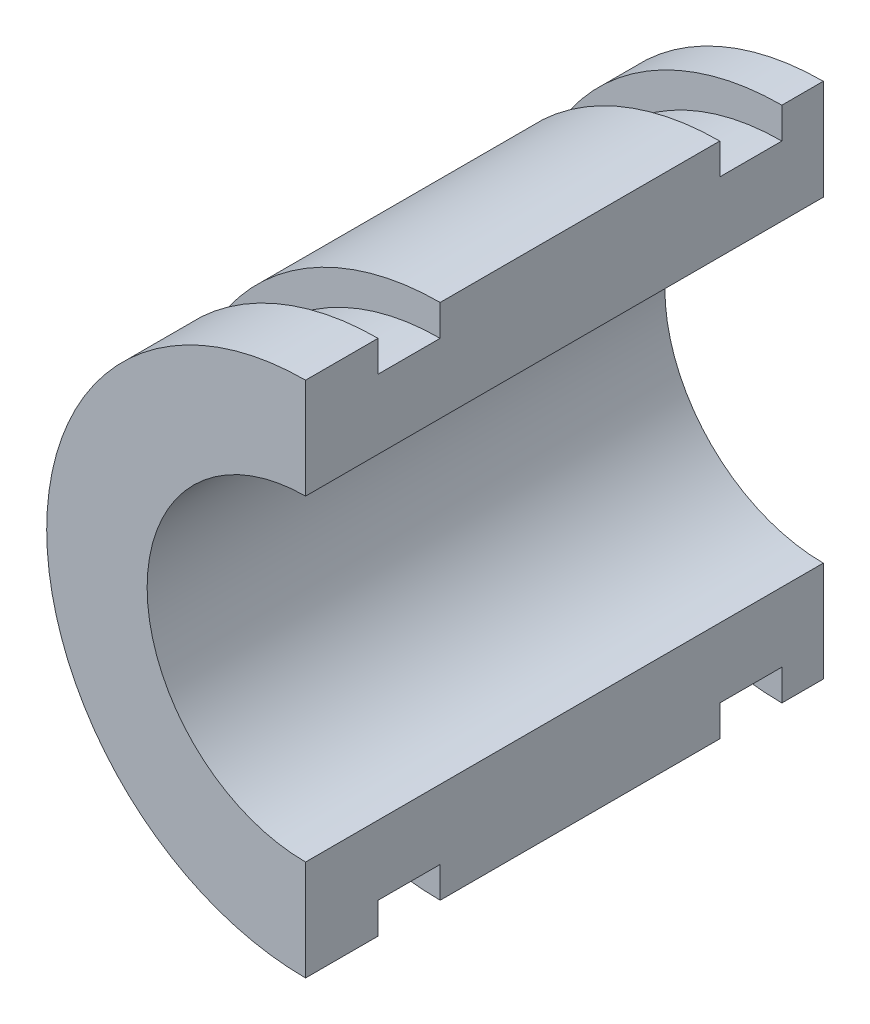
ISO-10303-21;
HEADER;
FILE_DESCRIPTION(('STEP AP214'),'2;1');
FILE_NAME('part.step','',(''),(''),'','','');
FILE_SCHEMA(('AUTOMOTIVE_DESIGN { 1 0 10303 214 1 1 1 1 }'));
ENDSEC;
DATA;
#1=APPLICATION_CONTEXT('core data for automotive mechanical design processes');
#2=APPLICATION_PROTOCOL_DEFINITION('international standard','automotive_design',2000,#1);
#3=PRODUCT_CONTEXT('',#1,'mechanical');
#4=PRODUCT('Part','Part','',(#3));
#5=PRODUCT_RELATED_PRODUCT_CATEGORY('part','',(#4));
#6=PRODUCT_DEFINITION_FORMATION('','',#4);
#7=PRODUCT_DEFINITION_CONTEXT('part definition',#1,'design');
#8=PRODUCT_DEFINITION('design','',#6,#7);
#9=PRODUCT_DEFINITION_SHAPE('','',#8);
#10=(LENGTH_UNIT() NAMED_UNIT(*) SI_UNIT(.MILLI.,.METRE.));
#11=(NAMED_UNIT(*) PLANE_ANGLE_UNIT() SI_UNIT($,.RADIAN.));
#12=(NAMED_UNIT(*) SI_UNIT($,.STERADIAN.) SOLID_ANGLE_UNIT());
#13=UNCERTAINTY_MEASURE_WITH_UNIT(LENGTH_MEASURE(1.E-05),#10,'distance_accuracy_value','');
#14=(GEOMETRIC_REPRESENTATION_CONTEXT(3) GLOBAL_UNCERTAINTY_ASSIGNED_CONTEXT((#13)) GLOBAL_UNIT_ASSIGNED_CONTEXT((#10,
#11,#12)) REPRESENTATION_CONTEXT('',''));
#15=CARTESIAN_POINT('',(0.,0.,0.));
#16=DIRECTION('',(0.,0.,1.));
#17=DIRECTION('',(1.,0.,0.));
#18=AXIS2_PLACEMENT_3D('',#15,#16,#17);
#19=CARTESIAN_POINT('',(0.,0.,25.));
#20=DIRECTION('',(0.,0.,-1.));
#21=DIRECTION('',(-1.,0.,0.));
#22=AXIS2_PLACEMENT_3D('',#19,#20,#21);
#23=CYLINDRICAL_SURFACE('',#22,12.5);
#24=DIRECTION('',(0.,0.,-1.));
#25=VECTOR('',#24,1.);
#26=CARTESIAN_POINT('',(0.,12.5,25.));
#27=LINE('',#26,#25);
#28=CARTESIAN_POINT('',(0.,12.5,18.5));
#29=VERTEX_POINT('',#28);
#30=CARTESIAN_POINT('',(0.,12.5,5.));
#31=VERTEX_POINT('',#30);
#32=EDGE_CURVE('E138',#29,#31,#27,.T.);
#33=ORIENTED_EDGE('',*,*,#32,.T.);
#34=CARTESIAN_POINT('',(0.,0.,5.));
#35=DIRECTION('',(0.,0.,-1.));
#36=DIRECTION('',(-1.,0.,0.));
#37=AXIS2_PLACEMENT_3D('',#34,#35,#36);
#38=CIRCLE('',#37,12.5);
#39=CARTESIAN_POINT('',(0.,-12.5,5.));
#40=VERTEX_POINT('',#39);
#41=EDGE_CURVE('E121',#40,#31,#38,.T.);
#42=ORIENTED_EDGE('',*,*,#41,.F.);
#43=DIRECTION('',(0.,0.,-1.));
#44=VECTOR('',#43,1.);
#45=CARTESIAN_POINT('',(0.,-12.5,25.));
#46=LINE('',#45,#44);
#47=CARTESIAN_POINT('',(0.,-12.5,18.5));
#48=VERTEX_POINT('',#47);
#49=EDGE_CURVE('E162',#48,#40,#46,.T.);
#50=ORIENTED_EDGE('',*,*,#49,.F.);
#51=CARTESIAN_POINT('',(0.,0.,18.5));
#52=DIRECTION('',(0.,0.,-1.));
#53=DIRECTION('',(-1.,0.,0.));
#54=AXIS2_PLACEMENT_3D('',#51,#52,#53);
#55=CIRCLE('',#54,12.5);
#56=EDGE_CURVE('E141',#48,#29,#55,.T.);
#57=ORIENTED_EDGE('',*,*,#56,.T.);
#58=EDGE_LOOP('',(#33,#42,#50,#57));
#59=FACE_BOUND('',#58,.T.);
#60=ADVANCED_FACE('F33',(#59),#23,.T.);
#61=CARTESIAN_POINT('',(0.,12.5,25.));
#62=VERTEX_POINT('',#61);
#63=CARTESIAN_POINT('',(0.,12.5,21.5));
#64=VERTEX_POINT('',#63);
#65=EDGE_CURVE('E142',#62,#64,#27,.T.);
#66=ORIENTED_EDGE('',*,*,#65,.T.);
#67=CARTESIAN_POINT('',(0.,0.,21.5));
#68=DIRECTION('',(0.,0.,-1.));
#69=DIRECTION('',(-1.,0.,0.));
#70=AXIS2_PLACEMENT_3D('',#67,#68,#69);
#71=CIRCLE('',#70,12.5);
#72=CARTESIAN_POINT('',(0.,-12.5,21.5));
#73=VERTEX_POINT('',#72);
#74=EDGE_CURVE('E190',#73,#64,#71,.T.);
#75=ORIENTED_EDGE('',*,*,#74,.F.);
#76=CARTESIAN_POINT('',(0.,-12.5,25.));
#77=VERTEX_POINT('',#76);
#78=EDGE_CURVE('E158',#77,#73,#46,.T.);
#79=ORIENTED_EDGE('',*,*,#78,.F.);
#80=CARTESIAN_POINT('',(0.,0.,25.));
#81=DIRECTION('',(0.,0.,1.));
#82=DIRECTION('',(-1.,0.,0.));
#83=AXIS2_PLACEMENT_3D('',#80,#81,#82);
#84=CIRCLE('',#83,12.5);
#85=EDGE_CURVE('E207',#62,#77,#84,.T.);
#86=ORIENTED_EDGE('',*,*,#85,.F.);
#87=EDGE_LOOP('',(#66,#75,#79,#86));
#88=FACE_BOUND('',#87,.T.);
#89=ADVANCED_FACE('F239',(#88),#23,.T.);
#90=CARTESIAN_POINT('',(0.,-12.5,2.));
#91=VERTEX_POINT('',#90);
#92=CARTESIAN_POINT('',(0.,-12.5,0.));
#93=VERTEX_POINT('',#92);
#94=EDGE_CURVE('E157',#91,#93,#46,.T.);
#95=ORIENTED_EDGE('',*,*,#94,.F.);
#96=CARTESIAN_POINT('',(0.,0.,2.));
#97=DIRECTION('',(0.,0.,-1.));
#98=DIRECTION('',(-1.,0.,0.));
#99=AXIS2_PLACEMENT_3D('',#96,#97,#98);
#100=CIRCLE('',#99,12.5);
#101=CARTESIAN_POINT('',(0.,12.5,2.));
#102=VERTEX_POINT('',#101);
#103=EDGE_CURVE('E131',#91,#102,#100,.T.);
#104=ORIENTED_EDGE('',*,*,#103,.T.);
#105=CARTESIAN_POINT('',(0.,12.5,0.));
#106=VERTEX_POINT('',#105);
#107=EDGE_CURVE('E143',#102,#106,#27,.T.);
#108=ORIENTED_EDGE('',*,*,#107,.T.);
#109=CARTESIAN_POINT('',(0.,0.,0.));
#110=DIRECTION('',(0.,0.,1.));
#111=DIRECTION('',(-1.,0.,0.));
#112=AXIS2_PLACEMENT_3D('',#109,#110,#111);
#113=CIRCLE('',#112,12.5);
#114=EDGE_CURVE('E206',#106,#93,#113,.T.);
#115=ORIENTED_EDGE('',*,*,#114,.T.);
#116=EDGE_LOOP('',(#95,#104,#108,#115));
#117=FACE_BOUND('',#116,.T.);
#118=ADVANCED_FACE('F35',(#117),#23,.T.);
#119=CARTESIAN_POINT('',(0.,-7.65,25.));
#120=DIRECTION('',(-1.,0.,0.));
#121=DIRECTION('',(0.,0.,1.));
#122=AXIS2_PLACEMENT_3D('',#119,#120,#121);
#123=PLANE('',#122);
#124=ORIENTED_EDGE('',*,*,#49,.T.);
#125=DIRECTION('',(0.,1.,0.));
#126=VECTOR('',#125,1.);
#127=CARTESIAN_POINT('',(0.,-7.65,5.));
#128=LINE('',#127,#126);
#129=CARTESIAN_POINT('',(0.,-11.,5.));
#130=VERTEX_POINT('',#129);
#131=EDGE_CURVE('E126',#40,#130,#128,.T.);
#132=ORIENTED_EDGE('',*,*,#131,.T.);
#133=DIRECTION('',(0.,0.,-1.));
#134=VECTOR('',#133,1.);
#135=CARTESIAN_POINT('',(0.,-11.,0.));
#136=LINE('',#135,#134);
#137=CARTESIAN_POINT('',(0.,-11.,2.));
#138=VERTEX_POINT('',#137);
#139=EDGE_CURVE('E186',#130,#138,#136,.T.);
#140=ORIENTED_EDGE('',*,*,#139,.T.);
#141=DIRECTION('',(0.,-1.,0.));
#142=VECTOR('',#141,1.);
#143=CARTESIAN_POINT('',(0.,-7.65,2.));
#144=LINE('',#143,#142);
#145=EDGE_CURVE('E184',#138,#91,#144,.T.);
#146=ORIENTED_EDGE('',*,*,#145,.T.);
#147=ORIENTED_EDGE('',*,*,#94,.T.);
#148=DIRECTION('',(0.,1.,0.));
#149=VECTOR('',#148,1.);
#150=CARTESIAN_POINT('',(0.,-7.65,0.));
#151=LINE('',#150,#149);
#152=CARTESIAN_POINT('',(0.,-7.65,0.));
#153=VERTEX_POINT('',#152);
#154=EDGE_CURVE('E216',#93,#153,#151,.T.);
#155=ORIENTED_EDGE('',*,*,#154,.T.);
#156=DIRECTION('',(0.,0.,-1.));
#157=VECTOR('',#156,1.);
#158=CARTESIAN_POINT('',(0.,-7.65,25.));
#159=LINE('',#158,#157);
#160=CARTESIAN_POINT('',(0.,-7.65,25.));
#161=VERTEX_POINT('',#160);
#162=EDGE_CURVE('E154',#161,#153,#159,.T.);
#163=ORIENTED_EDGE('',*,*,#162,.F.);
#164=DIRECTION('',(0.,1.,0.));
#165=VECTOR('',#164,1.);
#166=CARTESIAN_POINT('',(0.,-7.65,25.));
#167=LINE('',#166,#165);
#168=EDGE_CURVE('E210',#77,#161,#167,.T.);
#169=ORIENTED_EDGE('',*,*,#168,.F.);
#170=ORIENTED_EDGE('',*,*,#78,.T.);
#171=DIRECTION('',(0.,1.,0.));
#172=VECTOR('',#171,1.);
#173=CARTESIAN_POINT('',(0.,-7.65,21.5));
#174=LINE('',#173,#172);
#175=CARTESIAN_POINT('',(0.,-11.,21.5));
#176=VERTEX_POINT('',#175);
#177=EDGE_CURVE('E203',#73,#176,#174,.T.);
#178=ORIENTED_EDGE('',*,*,#177,.T.);
#179=DIRECTION('',(0.,0.,-1.));
#180=VECTOR('',#179,1.);
#181=CARTESIAN_POINT('',(0.,-11.,0.));
#182=LINE('',#181,#180);
#183=CARTESIAN_POINT('',(0.,-11.,18.5));
#184=VERTEX_POINT('',#183);
#185=EDGE_CURVE('E200',#176,#184,#182,.T.);
#186=ORIENTED_EDGE('',*,*,#185,.T.);
#187=DIRECTION('',(0.,-1.,0.));
#188=VECTOR('',#187,1.);
#189=CARTESIAN_POINT('',(0.,-7.65,18.5));
#190=LINE('',#189,#188);
#191=EDGE_CURVE('E197',#184,#48,#190,.T.);
#192=ORIENTED_EDGE('',*,*,#191,.T.);
#193=EDGE_LOOP('',(#124,#132,#140,#146,#147,#155,#163,#169,#170,#178,#186,#192));
#194=FACE_BOUND('',#193,.T.);
#195=ADVANCED_FACE('F229',(#194),#123,.F.);
#196=CARTESIAN_POINT('',(0.,0.,25.));
#197=DIRECTION('',(0.,0.,-1.));
#198=DIRECTION('',(-1.,0.,0.));
#199=AXIS2_PLACEMENT_3D('',#196,#197,#198);
#200=CYLINDRICAL_SURFACE('',#199,7.65);
#201=CARTESIAN_POINT('',(0.,0.,0.));
#202=DIRECTION('',(0.,0.,-1.));
#203=DIRECTION('',(1.,0.,0.));
#204=AXIS2_PLACEMENT_3D('',#201,#202,#203);
#205=CIRCLE('',#204,7.65);
#206=CARTESIAN_POINT('',(0.,7.65,0.));
#207=VERTEX_POINT('',#206);
#208=EDGE_CURVE('E217',#153,#207,#205,.T.);
#209=ORIENTED_EDGE('',*,*,#208,.T.);
#210=DIRECTION('',(0.,0.,-1.));
#211=VECTOR('',#210,1.);
#212=CARTESIAN_POINT('',(0.,7.65,25.));
#213=LINE('',#212,#211);
#214=CARTESIAN_POINT('',(0.,7.65,25.));
#215=VERTEX_POINT('',#214);
#216=EDGE_CURVE('E146',#215,#207,#213,.T.);
#217=ORIENTED_EDGE('',*,*,#216,.F.);
#218=CARTESIAN_POINT('',(0.,0.,25.));
#219=DIRECTION('',(0.,0.,-1.));
#220=DIRECTION('',(1.,0.,0.));
#221=AXIS2_PLACEMENT_3D('',#218,#219,#220);
#222=CIRCLE('',#221,7.65);
#223=EDGE_CURVE('E212',#161,#215,#222,.T.);
#224=ORIENTED_EDGE('',*,*,#223,.F.);
#225=ORIENTED_EDGE('',*,*,#162,.T.);
#226=EDGE_LOOP('',(#209,#217,#224,#225));
#227=FACE_BOUND('',#226,.T.);
#228=ADVANCED_FACE('F231',(#227),#200,.F.);
#229=CARTESIAN_POINT('',(0.,12.5,25.));
#230=DIRECTION('',(-1.,0.,0.));
#231=DIRECTION('',(0.,0.,1.));
#232=AXIS2_PLACEMENT_3D('',#229,#230,#231);
#233=PLANE('',#232);
#234=DIRECTION('',(0.,0.,-1.));
#235=VECTOR('',#234,1.);
#236=CARTESIAN_POINT('',(0.,11.,0.));
#237=LINE('',#236,#235);
#238=CARTESIAN_POINT('',(0.,11.,2.));
#239=VERTEX_POINT('',#238);
#240=CARTESIAN_POINT('',(0.,11.,5.));
#241=VERTEX_POINT('',#240);
#242=EDGE_CURVE('E41',#239,#241,#237,.F.);
#243=ORIENTED_EDGE('',*,*,#242,.T.);
#244=DIRECTION('',(0.,1.,0.));
#245=VECTOR('',#244,1.);
#246=CARTESIAN_POINT('',(0.,12.5,5.));
#247=LINE('',#246,#245);
#248=EDGE_CURVE('E11',#241,#31,#247,.T.);
#249=ORIENTED_EDGE('',*,*,#248,.T.);
#250=ORIENTED_EDGE('',*,*,#32,.F.);
#251=DIRECTION('',(0.,-1.,0.));
#252=VECTOR('',#251,1.);
#253=CARTESIAN_POINT('',(0.,12.5,18.5));
#254=LINE('',#253,#252);
#255=CARTESIAN_POINT('',(0.,11.,18.5));
#256=VERTEX_POINT('',#255);
#257=EDGE_CURVE('E161',#29,#256,#254,.T.);
#258=ORIENTED_EDGE('',*,*,#257,.T.);
#259=DIRECTION('',(0.,0.,-1.));
#260=VECTOR('',#259,1.);
#261=CARTESIAN_POINT('',(0.,11.,0.));
#262=LINE('',#261,#260);
#263=CARTESIAN_POINT('',(0.,11.,21.5));
#264=VERTEX_POINT('',#263);
#265=EDGE_CURVE('E164',#256,#264,#262,.F.);
#266=ORIENTED_EDGE('',*,*,#265,.T.);
#267=DIRECTION('',(0.,1.,0.));
#268=VECTOR('',#267,1.);
#269=CARTESIAN_POINT('',(0.,12.5,21.5));
#270=LINE('',#269,#268);
#271=EDGE_CURVE('E167',#264,#64,#270,.T.);
#272=ORIENTED_EDGE('',*,*,#271,.T.);
#273=ORIENTED_EDGE('',*,*,#65,.F.);
#274=DIRECTION('',(0.,1.,0.));
#275=VECTOR('',#274,1.);
#276=CARTESIAN_POINT('',(0.,12.5,25.));
#277=LINE('',#276,#275);
#278=EDGE_CURVE('E147',#215,#62,#277,.T.);
#279=ORIENTED_EDGE('',*,*,#278,.F.);
#280=ORIENTED_EDGE('',*,*,#216,.T.);
#281=DIRECTION('',(0.,1.,0.));
#282=VECTOR('',#281,1.);
#283=CARTESIAN_POINT('',(0.,12.5,0.));
#284=LINE('',#283,#282);
#285=EDGE_CURVE('E150',#207,#106,#284,.T.);
#286=ORIENTED_EDGE('',*,*,#285,.T.);
#287=ORIENTED_EDGE('',*,*,#107,.F.);
#288=DIRECTION('',(0.,-1.,0.));
#289=VECTOR('',#288,1.);
#290=CARTESIAN_POINT('',(0.,12.5,2.));
#291=LINE('',#290,#289);
#292=EDGE_CURVE('E170',#102,#239,#291,.T.);
#293=ORIENTED_EDGE('',*,*,#292,.T.);
#294=EDGE_LOOP('',(#243,#249,#250,#258,#266,#272,#273,#279,#280,#286,#287,#293));
#295=FACE_BOUND('',#294,.T.);
#296=ADVANCED_FACE('F136',(#295),#233,.F.);
#297=CARTESIAN_POINT('',(0.,0.,25.));
#298=DIRECTION('',(0.,0.,-1.));
#299=DIRECTION('',(-1.,0.,0.));
#300=AXIS2_PLACEMENT_3D('',#297,#298,#299);
#301=PLANE('',#300);
#302=ORIENTED_EDGE('',*,*,#85,.T.);
#303=ORIENTED_EDGE('',*,*,#168,.T.);
#304=ORIENTED_EDGE('',*,*,#223,.T.);
#305=ORIENTED_EDGE('',*,*,#278,.T.);
#306=EDGE_LOOP('',(#302,#303,#304,#305));
#307=FACE_BOUND('',#306,.T.);
#308=ADVANCED_FACE('F233',(#307),#301,.F.);
#309=CARTESIAN_POINT('',(0.,0.,0.));
#310=DIRECTION('',(0.,0.,-1.));
#311=DIRECTION('',(-1.,0.,0.));
#312=AXIS2_PLACEMENT_3D('',#309,#310,#311);
#313=PLANE('',#312);
#314=ORIENTED_EDGE('',*,*,#114,.F.);
#315=ORIENTED_EDGE('',*,*,#285,.F.);
#316=ORIENTED_EDGE('',*,*,#208,.F.);
#317=ORIENTED_EDGE('',*,*,#154,.F.);
#318=EDGE_LOOP('',(#314,#315,#316,#317));
#319=FACE_BOUND('',#318,.T.);
#320=ADVANCED_FACE('F226',(#319),#313,.T.);
#321=CARTESIAN_POINT('',(0.,12.5,21.5));
#322=DIRECTION('',(0.,0.,1.));
#323=DIRECTION('',(1.,0.,0.));
#324=AXIS2_PLACEMENT_3D('',#321,#322,#323);
#325=PLANE('',#324);
#326=ORIENTED_EDGE('',*,*,#74,.T.);
#327=ORIENTED_EDGE('',*,*,#271,.F.);
#328=CARTESIAN_POINT('',(0.,0.,21.5));
#329=DIRECTION('',(0.,0.,-1.));
#330=DIRECTION('',(-1.,0.,0.));
#331=AXIS2_PLACEMENT_3D('',#328,#329,#330);
#332=CIRCLE('',#331,11.);
#333=EDGE_CURVE('E194',#176,#264,#332,.T.);
#334=ORIENTED_EDGE('',*,*,#333,.F.);
#335=ORIENTED_EDGE('',*,*,#177,.F.);
#336=EDGE_LOOP('',(#326,#327,#334,#335));
#337=FACE_BOUND('',#336,.T.);
#338=ADVANCED_FACE('F241',(#337),#325,.F.);
#339=CARTESIAN_POINT('',(0.,0.,0.));
#340=DIRECTION('',(0.,0.,-1.));
#341=DIRECTION('',(-1.,0.,0.));
#342=AXIS2_PLACEMENT_3D('',#339,#340,#341);
#343=CYLINDRICAL_SURFACE('',#342,11.);
#344=ORIENTED_EDGE('',*,*,#333,.T.);
#345=ORIENTED_EDGE('',*,*,#265,.F.);
#346=CARTESIAN_POINT('',(0.,0.,18.5));
#347=DIRECTION('',(0.,0.,-1.));
#348=DIRECTION('',(-1.,0.,0.));
#349=AXIS2_PLACEMENT_3D('',#346,#347,#348);
#350=CIRCLE('',#349,11.);
#351=EDGE_CURVE('E56',#184,#256,#350,.T.);
#352=ORIENTED_EDGE('',*,*,#351,.F.);
#353=ORIENTED_EDGE('',*,*,#185,.F.);
#354=EDGE_LOOP('',(#344,#345,#352,#353));
#355=FACE_BOUND('',#354,.T.);
#356=ADVANCED_FACE('F244',(#355),#343,.T.);
#357=CARTESIAN_POINT('',(0.,12.5,18.5));
#358=DIRECTION('',(0.,0.,-1.));
#359=DIRECTION('',(-1.,0.,0.));
#360=AXIS2_PLACEMENT_3D('',#357,#358,#359);
#361=PLANE('',#360);
#362=ORIENTED_EDGE('',*,*,#351,.T.);
#363=ORIENTED_EDGE('',*,*,#257,.F.);
#364=ORIENTED_EDGE('',*,*,#56,.F.);
#365=ORIENTED_EDGE('',*,*,#191,.F.);
#366=EDGE_LOOP('',(#362,#363,#364,#365));
#367=FACE_BOUND('',#366,.T.);
#368=ADVANCED_FACE('F245',(#367),#361,.F.);
#369=CARTESIAN_POINT('',(0.,12.5,5.));
#370=DIRECTION('',(0.,0.,1.));
#371=DIRECTION('',(1.,0.,0.));
#372=AXIS2_PLACEMENT_3D('',#369,#370,#371);
#373=PLANE('',#372);
#374=ORIENTED_EDGE('',*,*,#41,.T.);
#375=ORIENTED_EDGE('',*,*,#248,.F.);
#376=CARTESIAN_POINT('',(0.,0.,5.));
#377=DIRECTION('',(0.,0.,-1.));
#378=DIRECTION('',(-1.,0.,0.));
#379=AXIS2_PLACEMENT_3D('',#376,#377,#378);
#380=CIRCLE('',#379,11.);
#381=EDGE_CURVE('E180',#130,#241,#380,.T.);
#382=ORIENTED_EDGE('',*,*,#381,.F.);
#383=ORIENTED_EDGE('',*,*,#131,.F.);
#384=EDGE_LOOP('',(#374,#375,#382,#383));
#385=FACE_BOUND('',#384,.T.);
#386=ADVANCED_FACE('F122',(#385),#373,.F.);
#387=CARTESIAN_POINT('',(0.,0.,0.));
#388=DIRECTION('',(0.,0.,-1.));
#389=DIRECTION('',(-1.,0.,0.));
#390=AXIS2_PLACEMENT_3D('',#387,#388,#389);
#391=CYLINDRICAL_SURFACE('',#390,11.);
#392=ORIENTED_EDGE('',*,*,#381,.T.);
#393=ORIENTED_EDGE('',*,*,#242,.F.);
#394=CARTESIAN_POINT('',(0.,0.,2.));
#395=DIRECTION('',(0.,0.,-1.));
#396=DIRECTION('',(-1.,0.,0.));
#397=AXIS2_PLACEMENT_3D('',#394,#395,#396);
#398=CIRCLE('',#397,11.);
#399=EDGE_CURVE('E48',#138,#239,#398,.T.);
#400=ORIENTED_EDGE('',*,*,#399,.F.);
#401=ORIENTED_EDGE('',*,*,#139,.F.);
#402=EDGE_LOOP('',(#392,#393,#400,#401));
#403=FACE_BOUND('',#402,.T.);
#404=ADVANCED_FACE('F252',(#403),#391,.T.);
#405=CARTESIAN_POINT('',(0.,12.5,2.));
#406=DIRECTION('',(0.,0.,-1.));
#407=DIRECTION('',(-1.,0.,0.));
#408=AXIS2_PLACEMENT_3D('',#405,#406,#407);
#409=PLANE('',#408);
#410=ORIENTED_EDGE('',*,*,#399,.T.);
#411=ORIENTED_EDGE('',*,*,#292,.F.);
#412=ORIENTED_EDGE('',*,*,#103,.F.);
#413=ORIENTED_EDGE('',*,*,#145,.F.);
#414=EDGE_LOOP('',(#410,#411,#412,#413));
#415=FACE_BOUND('',#414,.T.);
#416=ADVANCED_FACE('F174',(#415),#409,.F.);
#417=CLOSED_SHELL('',(#60,#89,#118,#195,#228,#296,#308,#320,#338,#356,#368,#386,#404,#416));
#418=MANIFOLD_SOLID_BREP('B2',#417);
#419=ADVANCED_BREP_SHAPE_REPRESENTATION('',(#18,#418),#14);
#420=SHAPE_DEFINITION_REPRESENTATION(#9,#419);
ENDSEC;
END-ISO-10303-21;
